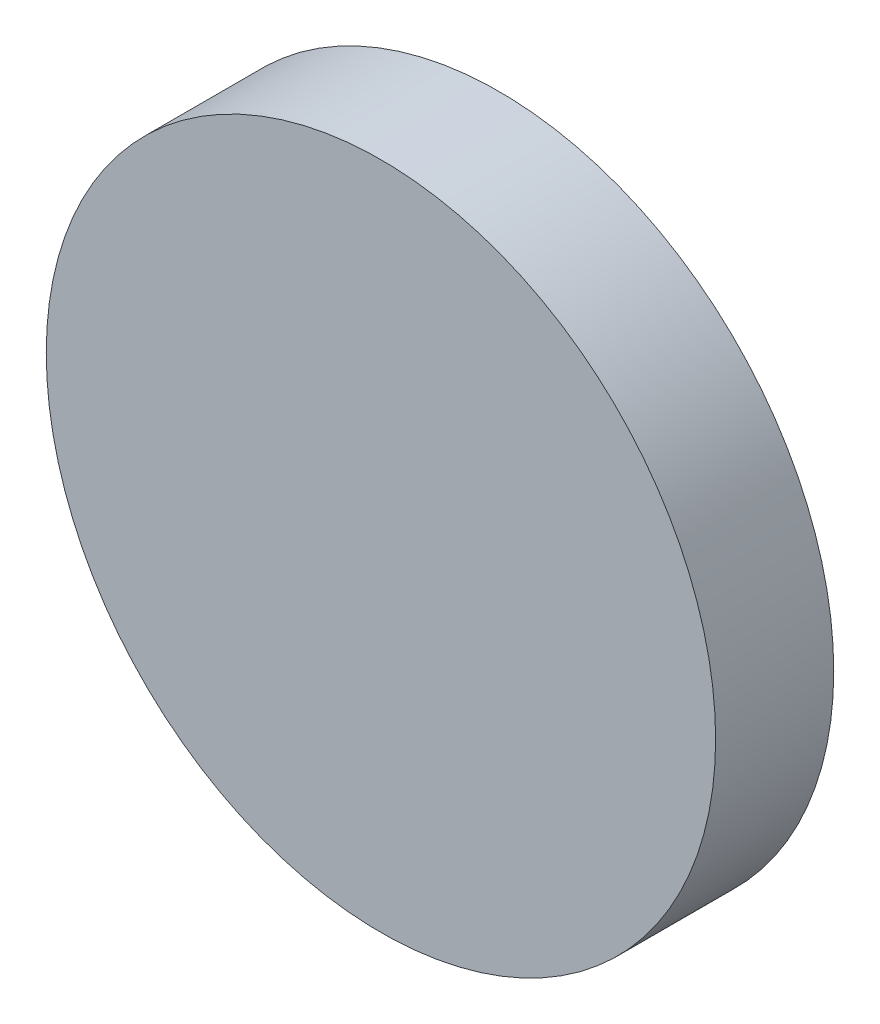
ISO-10303-21;
HEADER;
FILE_DESCRIPTION(('STEP AP214'),'2;1');
FILE_NAME('part.step','',(''),(''),'','','');
FILE_SCHEMA(('AUTOMOTIVE_DESIGN { 1 0 10303 214 1 1 1 1 }'));
ENDSEC;
DATA;
#1=APPLICATION_CONTEXT('core data for automotive mechanical design processes');
#2=APPLICATION_PROTOCOL_DEFINITION('international standard','automotive_design',2000,#1);
#3=PRODUCT_CONTEXT('',#1,'mechanical');
#4=PRODUCT('Part','Part','',(#3));
#5=PRODUCT_RELATED_PRODUCT_CATEGORY('part','',(#4));
#6=PRODUCT_DEFINITION_FORMATION('','',#4);
#7=PRODUCT_DEFINITION_CONTEXT('part definition',#1,'design');
#8=PRODUCT_DEFINITION('design','',#6,#7);
#9=PRODUCT_DEFINITION_SHAPE('','',#8);
#10=(LENGTH_UNIT() NAMED_UNIT(*) SI_UNIT(.MILLI.,.METRE.));
#11=(NAMED_UNIT(*) PLANE_ANGLE_UNIT() SI_UNIT($,.RADIAN.));
#12=(NAMED_UNIT(*) SI_UNIT($,.STERADIAN.) SOLID_ANGLE_UNIT());
#13=UNCERTAINTY_MEASURE_WITH_UNIT(LENGTH_MEASURE(1.E-05),#10,'distance_accuracy_value','');
#14=(GEOMETRIC_REPRESENTATION_CONTEXT(3) GLOBAL_UNCERTAINTY_ASSIGNED_CONTEXT((#13)) GLOBAL_UNIT_ASSIGNED_CONTEXT((#10,
#11,#12)) REPRESENTATION_CONTEXT('',''));
#15=CARTESIAN_POINT('',(0.,0.,0.));
#16=DIRECTION('',(0.,0.,1.));
#17=DIRECTION('',(1.,0.,0.));
#18=AXIS2_PLACEMENT_3D('',#15,#16,#17);
#19=CARTESIAN_POINT('',(0.,0.,12.));
#20=DIRECTION('',(0.,0.,-1.));
#21=DIRECTION('',(-1.,0.,0.));
#22=AXIS2_PLACEMENT_3D('',#19,#20,#21);
#23=CYLINDRICAL_SURFACE('',#22,32.);
#24=CARTESIAN_POINT('',(0.,0.,0.));
#25=DIRECTION('',(0.,0.,1.));
#26=DIRECTION('',(1.,0.,0.));
#27=AXIS2_PLACEMENT_3D('',#24,#25,#26);
#28=CIRCLE('',#27,32.);
#29=CARTESIAN_POINT('',(32.,0.,0.));
#30=VERTEX_POINT('',#29);
#31=EDGE_CURVE('E51',#30,#30,#28,.T.);
#32=ORIENTED_EDGE('',*,*,#31,.F.);
#33=EDGE_LOOP('',(#32));
#34=FACE_BOUND('',#33,.T.);
#35=CARTESIAN_POINT('',(0.,0.,10.));
#36=DIRECTION('',(0.,0.,1.));
#37=DIRECTION('',(1.,0.,0.));
#38=AXIS2_PLACEMENT_3D('',#35,#36,#37);
#39=CIRCLE('',#38,32.);
#40=CARTESIAN_POINT('',(32.,0.,10.));
#41=VERTEX_POINT('',#40);
#42=EDGE_CURVE('E55',#41,#41,#39,.T.);
#43=ORIENTED_EDGE('',*,*,#42,.T.);
#44=EDGE_LOOP('',(#43));
#45=FACE_BOUND('',#44,.T.);
#46=ADVANCED_FACE('F35',(#34,#45),#23,.F.);
#47=CARTESIAN_POINT('',(0.,0.,12.));
#48=DIRECTION('',(0.,0.,1.));
#49=DIRECTION('',(1.,0.,0.));
#50=AXIS2_PLACEMENT_3D('',#47,#48,#49);
#51=PLANE('',#50);
#52=CARTESIAN_POINT('',(0.,0.,12.));
#53=DIRECTION('',(0.,0.,1.));
#54=DIRECTION('',(1.,0.,0.));
#55=AXIS2_PLACEMENT_3D('',#52,#53,#54);
#56=CIRCLE('',#55,34.);
#57=CARTESIAN_POINT('',(34.,0.,12.));
#58=VERTEX_POINT('',#57);
#59=EDGE_CURVE('E42',#58,#58,#56,.T.);
#60=ORIENTED_EDGE('',*,*,#59,.T.);
#61=EDGE_LOOP('',(#60));
#62=FACE_BOUND('',#61,.T.);
#63=ADVANCED_FACE('F90',(#62),#51,.T.);
#64=CARTESIAN_POINT('',(0.,0.,0.));
#65=DIRECTION('',(0.,0.,1.));
#66=DIRECTION('',(1.,0.,0.));
#67=AXIS2_PLACEMENT_3D('',#64,#65,#66);
#68=PLANE('',#67);
#69=CARTESIAN_POINT('',(0.,0.,0.));
#70=DIRECTION('',(0.,0.,1.));
#71=DIRECTION('',(1.,0.,0.));
#72=AXIS2_PLACEMENT_3D('',#69,#70,#71);
#73=CIRCLE('',#72,34.);
#74=CARTESIAN_POINT('',(34.,0.,0.));
#75=VERTEX_POINT('',#74);
#76=EDGE_CURVE('E46',#75,#75,#73,.T.);
#77=ORIENTED_EDGE('',*,*,#76,.F.);
#78=EDGE_LOOP('',(#77));
#79=FACE_BOUND('',#78,.T.);
#80=ORIENTED_EDGE('',*,*,#31,.T.);
#81=EDGE_LOOP('',(#80));
#82=FACE_BOUND('',#81,.T.);
#83=ADVANCED_FACE('F96',(#79,#82),#68,.F.);
#84=CARTESIAN_POINT('',(0.,0.,12.));
#85=DIRECTION('',(0.,0.,-1.));
#86=DIRECTION('',(-1.,0.,0.));
#87=AXIS2_PLACEMENT_3D('',#84,#85,#86);
#88=CYLINDRICAL_SURFACE('',#87,34.);
#89=ORIENTED_EDGE('',*,*,#59,.F.);
#90=EDGE_LOOP('',(#89));
#91=FACE_BOUND('',#90,.T.);
#92=ORIENTED_EDGE('',*,*,#76,.T.);
#93=EDGE_LOOP('',(#92));
#94=FACE_BOUND('',#93,.T.);
#95=ADVANCED_FACE('F37',(#91,#94),#88,.T.);
#96=CARTESIAN_POINT('',(0.,0.,10.));
#97=DIRECTION('',(0.,0.,1.));
#98=DIRECTION('',(1.,0.,0.));
#99=AXIS2_PLACEMENT_3D('',#96,#97,#98);
#100=PLANE('',#99);
#101=CARTESIAN_POINT('',(0.,0.,10.));
#102=DIRECTION('',(0.,0.,1.));
#103=DIRECTION('',(1.,0.,0.));
#104=AXIS2_PLACEMENT_3D('',#101,#102,#103);
#105=CIRCLE('',#104,10.);
#106=CARTESIAN_POINT('',(10.,0.,10.));
#107=VERTEX_POINT('',#106);
#108=EDGE_CURVE('E10',#107,#107,#105,.F.);
#109=ORIENTED_EDGE('',*,*,#108,.F.);
#110=EDGE_LOOP('',(#109));
#111=FACE_BOUND('',#110,.T.);
#112=ORIENTED_EDGE('',*,*,#42,.F.);
#113=EDGE_LOOP('',(#112));
#114=FACE_BOUND('',#113,.T.);
#115=ADVANCED_FACE('F84',(#111,#114),#100,.F.);
#116=CARTESIAN_POINT('',(0.,0.,3.));
#117=DIRECTION('',(0.,0.,-1.));
#118=DIRECTION('',(-1.,0.,0.));
#119=AXIS2_PLACEMENT_3D('',#116,#117,#118);
#120=PLANE('',#119);
#121=CARTESIAN_POINT('',(0.,0.,3.));
#122=DIRECTION('',(0.,0.,-1.));
#123=DIRECTION('',(-1.,0.,0.));
#124=AXIS2_PLACEMENT_3D('',#121,#122,#123);
#125=CIRCLE('',#124,10.);
#126=CARTESIAN_POINT('',(-10.,0.,3.));
#127=VERTEX_POINT('',#126);
#128=EDGE_CURVE('E57',#127,#127,#125,.T.);
#129=ORIENTED_EDGE('',*,*,#128,.T.);
#130=EDGE_LOOP('',(#129));
#131=FACE_BOUND('',#130,.T.);
#132=CARTESIAN_POINT('',(0.,0.,3.));
#133=DIRECTION('',(0.,0.,-1.));
#134=DIRECTION('',(-1.,0.,0.));
#135=AXIS2_PLACEMENT_3D('',#132,#133,#134);
#136=CIRCLE('',#135,8.5);
#137=CARTESIAN_POINT('',(-8.5,0.,3.));
#138=VERTEX_POINT('',#137);
#139=EDGE_CURVE('E62',#138,#138,#136,.T.);
#140=ORIENTED_EDGE('',*,*,#139,.F.);
#141=EDGE_LOOP('',(#140));
#142=FACE_BOUND('',#141,.T.);
#143=ADVANCED_FACE('F85',(#131,#142),#120,.T.);
#144=CARTESIAN_POINT('',(0.,0.,3.));
#145=DIRECTION('',(0.,0.,1.));
#146=DIRECTION('',(1.,0.,0.));
#147=AXIS2_PLACEMENT_3D('',#144,#145,#146);
#148=CYLINDRICAL_SURFACE('',#147,10.);
#149=ORIENTED_EDGE('',*,*,#128,.F.);
#150=EDGE_LOOP('',(#149));
#151=FACE_BOUND('',#150,.T.);
#152=ORIENTED_EDGE('',*,*,#108,.T.);
#153=EDGE_LOOP('',(#152));
#154=FACE_BOUND('',#153,.T.);
#155=ADVANCED_FACE('F76',(#151,#154),#148,.T.);
#156=CARTESIAN_POINT('',(0.,0.,3.));
#157=DIRECTION('',(0.,0.,1.));
#158=DIRECTION('',(1.,0.,0.));
#159=AXIS2_PLACEMENT_3D('',#156,#157,#158);
#160=CYLINDRICAL_SURFACE('',#159,8.5);
#161=ORIENTED_EDGE('',*,*,#139,.T.);
#162=EDGE_LOOP('',(#161));
#163=FACE_BOUND('',#162,.T.);
#164=CARTESIAN_POINT('',(0.,0.,10.));
#165=DIRECTION('',(0.,0.,-1.));
#166=DIRECTION('',(-1.,0.,0.));
#167=AXIS2_PLACEMENT_3D('',#164,#165,#166);
#168=CIRCLE('',#167,8.5);
#169=CARTESIAN_POINT('',(-8.5,0.,10.));
#170=VERTEX_POINT('',#169);
#171=EDGE_CURVE('E66',#170,#170,#168,.T.);
#172=ORIENTED_EDGE('',*,*,#171,.F.);
#173=EDGE_LOOP('',(#172));
#174=FACE_BOUND('',#173,.T.);
#175=ADVANCED_FACE('F74',(#163,#174),#160,.F.);
#176=ORIENTED_EDGE('',*,*,#171,.T.);
#177=EDGE_LOOP('',(#176));
#178=FACE_BOUND('',#177,.T.);
#179=ADVANCED_FACE('F72',(#178),#100,.F.);
#180=CLOSED_SHELL('',(#46,#63,#83,#95,#115,#143,#155,#175,#179));
#181=MANIFOLD_SOLID_BREP('B2',#180);
#182=ADVANCED_BREP_SHAPE_REPRESENTATION('',(#18,#181),#14);
#183=SHAPE_DEFINITION_REPRESENTATION(#9,#182);
ENDSEC;
END-ISO-10303-21;
